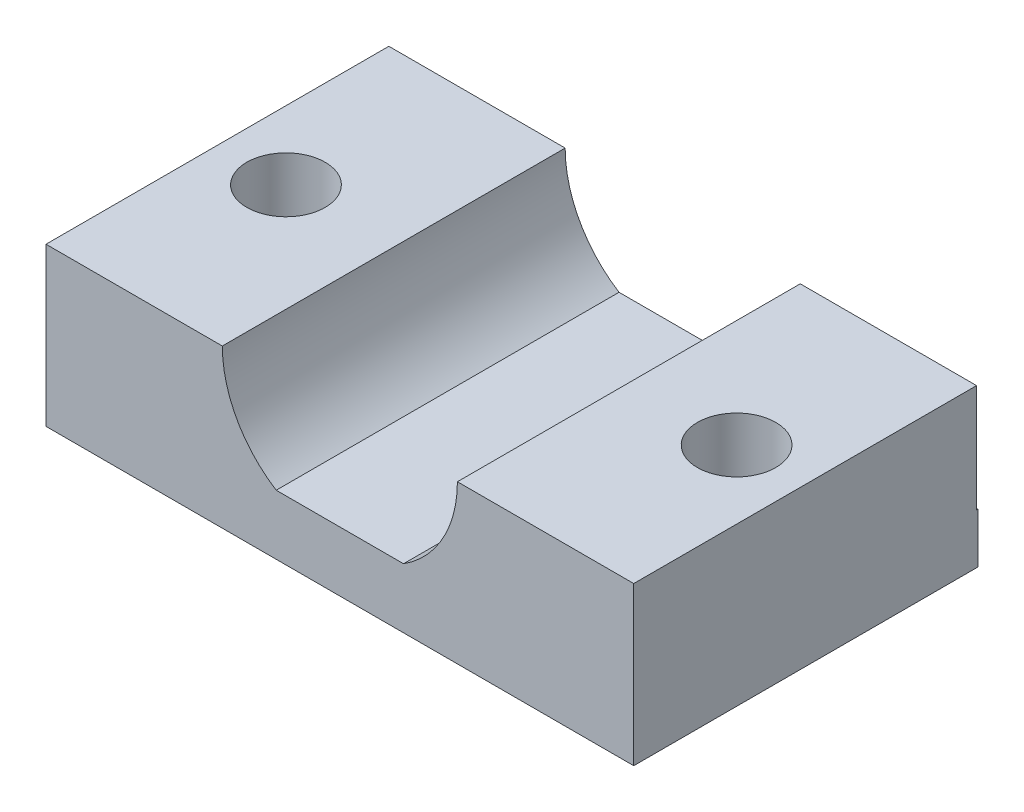
ISO-10303-21;
HEADER;
FILE_DESCRIPTION(('STEP AP214'),'2;1');
FILE_NAME('part.step','',(''),(''),'','','');
FILE_SCHEMA(('AUTOMOTIVE_DESIGN { 1 0 10303 214 1 1 1 1 }'));
ENDSEC;
DATA;
#1=APPLICATION_CONTEXT('core data for automotive mechanical design processes');
#2=APPLICATION_PROTOCOL_DEFINITION('international standard','automotive_design',2000,#1);
#3=PRODUCT_CONTEXT('',#1,'mechanical');
#4=PRODUCT('Part','Part','',(#3));
#5=PRODUCT_RELATED_PRODUCT_CATEGORY('part','',(#4));
#6=PRODUCT_DEFINITION_FORMATION('','',#4);
#7=PRODUCT_DEFINITION_CONTEXT('part definition',#1,'design');
#8=PRODUCT_DEFINITION('design','',#6,#7);
#9=PRODUCT_DEFINITION_SHAPE('','',#8);
#10=(LENGTH_UNIT() NAMED_UNIT(*) SI_UNIT(.MILLI.,.METRE.));
#11=(NAMED_UNIT(*) PLANE_ANGLE_UNIT() SI_UNIT($,.RADIAN.));
#12=(NAMED_UNIT(*) SI_UNIT($,.STERADIAN.) SOLID_ANGLE_UNIT());
#13=UNCERTAINTY_MEASURE_WITH_UNIT(LENGTH_MEASURE(1.E-05),#10,'distance_accuracy_value','');
#14=(GEOMETRIC_REPRESENTATION_CONTEXT(3) GLOBAL_UNCERTAINTY_ASSIGNED_CONTEXT((#13)) GLOBAL_UNIT_ASSIGNED_CONTEXT((#10,
#11,#12)) REPRESENTATION_CONTEXT('',''));
#15=CARTESIAN_POINT('',(0.,0.,0.));
#16=DIRECTION('',(0.,0.,1.));
#17=DIRECTION('',(1.,0.,0.));
#18=AXIS2_PLACEMENT_3D('',#15,#16,#17);
#19=CARTESIAN_POINT('',(-0.0795454545454739,36.0000025251893,-17.5));
#20=DIRECTION('',(0.,0.,1.));
#21=DIRECTION('',(1.,0.,0.));
#22=AXIS2_PLACEMENT_3D('',#19,#20,#21);
#23=PLANE('',#22);
#24=DIRECTION('',(-1.,0.,0.));
#25=VECTOR('',#24,1.);
#26=CARTESIAN_POINT('',(15.,30.5,-17.5));
#27=LINE('',#26,#25);
#28=CARTESIAN_POINT('',(15.,30.5,-17.5));
#29=VERTEX_POINT('',#28);
#30=CARTESIAN_POINT('',(-15.,30.5,-17.5));
#31=VERTEX_POINT('',#30);
#32=EDGE_CURVE('E183',#29,#31,#27,.T.);
#33=ORIENTED_EDGE('',*,*,#32,.T.);
#34=DIRECTION('',(0.,1.,0.));
#35=VECTOR('',#34,1.);
#36=CARTESIAN_POINT('',(-15.,24.,-17.5));
#37=LINE('',#36,#35);
#38=CARTESIAN_POINT('',(-15.,36.0000025251892,-17.5));
#39=VERTEX_POINT('',#38);
#40=EDGE_CURVE('E189',#31,#39,#37,.T.);
#41=ORIENTED_EDGE('',*,*,#40,.T.);
#42=DIRECTION('',(1.,0.,0.));
#43=VECTOR('',#42,1.);
#44=CARTESIAN_POINT('',(-15.,36.0000025251892,-17.5));
#45=LINE('',#44,#43);
#46=CARTESIAN_POINT('',(-6.00000000000002,36.0000025251892,-17.5));
#47=VERTEX_POINT('',#46);
#48=EDGE_CURVE('E192',#39,#47,#45,.T.);
#49=ORIENTED_EDGE('',*,*,#48,.T.);
#50=CARTESIAN_POINT('',(-0.0795454545454739,36.0000025251893,-17.5));
#51=DIRECTION('',(0.,0.,1.));
#52=DIRECTION('',(1.,0.,0.));
#53=AXIS2_PLACEMENT_3D('',#50,#51,#52);
#54=CIRCLE('',#53,5.92045454545454);
#55=CARTESIAN_POINT('',(-3.25,31.0000025251893,-17.5));
#56=VERTEX_POINT('',#55);
#57=EDGE_CURVE('E196',#47,#56,#54,.T.);
#58=ORIENTED_EDGE('',*,*,#57,.T.);
#59=DIRECTION('',(1.,0.,0.));
#60=VECTOR('',#59,1.);
#61=CARTESIAN_POINT('',(3.25,31.0000025251893,-17.5));
#62=LINE('',#61,#60);
#63=CARTESIAN_POINT('',(3.25,31.0000025251893,-17.5));
#64=VERTEX_POINT('',#63);
#65=EDGE_CURVE('E199',#56,#64,#62,.T.);
#66=ORIENTED_EDGE('',*,*,#65,.T.);
#67=CARTESIAN_POINT('',(0.0795454545454739,36.0000025251893,-17.5));
#68=DIRECTION('',(0.,0.,1.));
#69=DIRECTION('',(-1.,0.,0.));
#70=AXIS2_PLACEMENT_3D('',#67,#68,#69);
#71=CIRCLE('',#70,5.92045454545454);
#72=CARTESIAN_POINT('',(6.00000000000002,36.0000025251892,-17.5));
#73=VERTEX_POINT('',#72);
#74=EDGE_CURVE('E202',#64,#73,#71,.T.);
#75=ORIENTED_EDGE('',*,*,#74,.T.);
#76=DIRECTION('',(1.,0.,0.));
#77=VECTOR('',#76,1.);
#78=CARTESIAN_POINT('',(15.,36.0000025251892,-17.5));
#79=LINE('',#78,#77);
#80=CARTESIAN_POINT('',(15.,36.0000025251892,-17.5));
#81=VERTEX_POINT('',#80);
#82=EDGE_CURVE('E205',#73,#81,#79,.T.);
#83=ORIENTED_EDGE('',*,*,#82,.T.);
#84=DIRECTION('',(0.,-1.,0.));
#85=VECTOR('',#84,1.);
#86=CARTESIAN_POINT('',(15.,24.,-17.5));
#87=LINE('',#86,#85);
#88=EDGE_CURVE('E208',#81,#29,#87,.T.);
#89=ORIENTED_EDGE('',*,*,#88,.T.);
#90=EDGE_LOOP('',(#33,#41,#49,#58,#66,#75,#83,#89));
#91=FACE_BOUND('',#90,.T.);
#92=ADVANCED_FACE('F43',(#91),#23,.F.);
#93=CARTESIAN_POINT('',(22.5,4.,0.));
#94=DIRECTION('',(0.,0.,-1.));
#95=DIRECTION('',(-1.,0.,0.));
#96=AXIS2_PLACEMENT_3D('',#93,#94,#95);
#97=PLANE('',#96);
#98=DIRECTION('',(0.,-1.,0.));
#99=VECTOR('',#98,1.);
#100=CARTESIAN_POINT('',(-15.,24.,0.));
#101=LINE('',#100,#99);
#102=CARTESIAN_POINT('',(-15.,36.0000025251892,0.));
#103=VERTEX_POINT('',#102);
#104=CARTESIAN_POINT('',(-15.,27.9456875732357,0.));
#105=VERTEX_POINT('',#104);
#106=EDGE_CURVE('E52',#103,#105,#101,.T.);
#107=ORIENTED_EDGE('',*,*,#106,.T.);
#108=DIRECTION('',(1.,0.,0.));
#109=VECTOR('',#108,1.);
#110=CARTESIAN_POINT('',(-22.5,27.9456875732357,0.));
#111=LINE('',#110,#109);
#112=CARTESIAN_POINT('',(15.,27.9456875732357,0.));
#113=VERTEX_POINT('',#112);
#114=EDGE_CURVE('E122',#105,#113,#111,.T.);
#115=ORIENTED_EDGE('',*,*,#114,.T.);
#116=DIRECTION('',(0.,-1.,0.));
#117=VECTOR('',#116,1.);
#118=CARTESIAN_POINT('',(15.,24.,0.));
#119=LINE('',#118,#117);
#120=CARTESIAN_POINT('',(15.,36.0000025251892,0.));
#121=VERTEX_POINT('',#120);
#122=EDGE_CURVE('E148',#121,#113,#119,.T.);
#123=ORIENTED_EDGE('',*,*,#122,.F.);
#124=DIRECTION('',(1.,0.,0.));
#125=VECTOR('',#124,1.);
#126=CARTESIAN_POINT('',(15.,36.0000025251892,0.));
#127=LINE('',#126,#125);
#128=CARTESIAN_POINT('',(6.00000000000002,36.0000025251892,0.));
#129=VERTEX_POINT('',#128);
#130=EDGE_CURVE('E193',#129,#121,#127,.T.);
#131=ORIENTED_EDGE('',*,*,#130,.F.);
#132=CARTESIAN_POINT('',(0.0795454545454739,36.0000025251893,0.));
#133=DIRECTION('',(0.,0.,1.));
#134=DIRECTION('',(-1.,0.,0.));
#135=AXIS2_PLACEMENT_3D('',#132,#133,#134);
#136=CIRCLE('',#135,5.92045454545454);
#137=CARTESIAN_POINT('',(3.25,31.0000025251893,0.));
#138=VERTEX_POINT('',#137);
#139=EDGE_CURVE('E220',#138,#129,#136,.T.);
#140=ORIENTED_EDGE('',*,*,#139,.F.);
#141=DIRECTION('',(1.,0.,0.));
#142=VECTOR('',#141,1.);
#143=CARTESIAN_POINT('',(3.25,31.0000025251893,0.));
#144=LINE('',#143,#142);
#145=CARTESIAN_POINT('',(-3.25,31.0000025251893,0.));
#146=VERTEX_POINT('',#145);
#147=EDGE_CURVE('E217',#146,#138,#144,.T.);
#148=ORIENTED_EDGE('',*,*,#147,.F.);
#149=CARTESIAN_POINT('',(-0.0795454545454739,36.0000025251893,0.));
#150=DIRECTION('',(0.,0.,1.));
#151=DIRECTION('',(1.,0.,0.));
#152=AXIS2_PLACEMENT_3D('',#149,#150,#151);
#153=CIRCLE('',#152,5.92045454545454);
#154=CARTESIAN_POINT('',(-6.00000000000002,36.0000025251892,0.));
#155=VERTEX_POINT('',#154);
#156=EDGE_CURVE('E214',#155,#146,#153,.T.);
#157=ORIENTED_EDGE('',*,*,#156,.F.);
#158=DIRECTION('',(1.,0.,0.));
#159=VECTOR('',#158,1.);
#160=CARTESIAN_POINT('',(-15.,36.0000025251892,0.));
#161=LINE('',#160,#159);
#162=EDGE_CURVE('E146',#103,#155,#161,.T.);
#163=ORIENTED_EDGE('',*,*,#162,.F.);
#164=EDGE_LOOP('',(#107,#115,#123,#131,#140,#148,#157,#163));
#165=FACE_BOUND('',#164,.T.);
#166=ADVANCED_FACE('F45',(#165),#97,.F.);
#167=CARTESIAN_POINT('',(-15.,24.,-20.));
#168=DIRECTION('',(1.,0.,0.));
#169=DIRECTION('',(0.,0.,-1.));
#170=AXIS2_PLACEMENT_3D('',#167,#168,#169);
#171=PLANE('',#170);
#172=DIRECTION('',(0.,-1.,0.));
#173=VECTOR('',#172,1.);
#174=CARTESIAN_POINT('',(-15.,24.,-17.5728496854362));
#175=LINE('',#174,#173);
#176=CARTESIAN_POINT('',(-15.,30.5,-17.5728496854362));
#177=VERTEX_POINT('',#176);
#178=CARTESIAN_POINT('',(-15.,27.9456875732357,-17.5728496854362));
#179=VERTEX_POINT('',#178);
#180=EDGE_CURVE('E59',#177,#179,#175,.T.);
#181=ORIENTED_EDGE('',*,*,#180,.T.);
#182=DIRECTION('',(0.,0.,1.));
#183=VECTOR('',#182,1.);
#184=CARTESIAN_POINT('',(-15.,27.9456875732357,-20.));
#185=LINE('',#184,#183);
#186=EDGE_CURVE('E126',#179,#105,#185,.T.);
#187=ORIENTED_EDGE('',*,*,#186,.T.);
#188=ORIENTED_EDGE('',*,*,#106,.F.);
#189=DIRECTION('',(0.,0.,1.));
#190=VECTOR('',#189,1.);
#191=CARTESIAN_POINT('',(-15.,36.0000025251892,-17.5));
#192=LINE('',#191,#190);
#193=EDGE_CURVE('E151',#39,#103,#192,.T.);
#194=ORIENTED_EDGE('',*,*,#193,.F.);
#195=ORIENTED_EDGE('',*,*,#40,.F.);
#196=DIRECTION('',(0.,0.,1.));
#197=VECTOR('',#196,1.);
#198=CARTESIAN_POINT('',(-15.,30.5,-27.));
#199=LINE('',#198,#197);
#200=EDGE_CURVE('E177',#177,#31,#199,.T.);
#201=ORIENTED_EDGE('',*,*,#200,.F.);
#202=EDGE_LOOP('',(#181,#187,#188,#194,#195,#201));
#203=FACE_BOUND('',#202,.T.);
#204=ADVANCED_FACE('F137',(#203),#171,.F.);
#205=CARTESIAN_POINT('',(15.,24.,-20.));
#206=DIRECTION('',(-1.,0.,0.));
#207=DIRECTION('',(0.,0.,1.));
#208=AXIS2_PLACEMENT_3D('',#205,#206,#207);
#209=PLANE('',#208);
#210=ORIENTED_EDGE('',*,*,#122,.T.);
#211=DIRECTION('',(0.,0.,-1.));
#212=VECTOR('',#211,1.);
#213=CARTESIAN_POINT('',(15.,27.9456875732357,-20.));
#214=LINE('',#213,#212);
#215=CARTESIAN_POINT('',(15.,27.9456875732357,-17.5728496854362));
#216=VERTEX_POINT('',#215);
#217=EDGE_CURVE('E128',#113,#216,#214,.T.);
#218=ORIENTED_EDGE('',*,*,#217,.T.);
#219=DIRECTION('',(0.,1.,0.));
#220=VECTOR('',#219,1.);
#221=CARTESIAN_POINT('',(15.,24.,-17.5728496854362));
#222=LINE('',#221,#220);
#223=CARTESIAN_POINT('',(15.,30.5,-17.5728496854362));
#224=VERTEX_POINT('',#223);
#225=EDGE_CURVE('E142',#216,#224,#222,.T.);
#226=ORIENTED_EDGE('',*,*,#225,.T.);
#227=DIRECTION('',(0.,0.,1.));
#228=VECTOR('',#227,1.);
#229=CARTESIAN_POINT('',(15.,30.5,-27.));
#230=LINE('',#229,#228);
#231=EDGE_CURVE('E66',#224,#29,#230,.T.);
#232=ORIENTED_EDGE('',*,*,#231,.T.);
#233=ORIENTED_EDGE('',*,*,#88,.F.);
#234=DIRECTION('',(0.,0.,1.));
#235=VECTOR('',#234,1.);
#236=CARTESIAN_POINT('',(15.,36.0000025251892,-17.5));
#237=LINE('',#236,#235);
#238=EDGE_CURVE('E211',#81,#121,#237,.T.);
#239=ORIENTED_EDGE('',*,*,#238,.T.);
#240=EDGE_LOOP('',(#210,#218,#226,#232,#233,#239));
#241=FACE_BOUND('',#240,.T.);
#242=ADVANCED_FACE('F255',(#241),#209,.F.);
#243=CARTESIAN_POINT('',(-15.,36.0000025251892,-17.5));
#244=DIRECTION('',(0.,-1.,0.));
#245=DIRECTION('',(1.,0.,0.));
#246=AXIS2_PLACEMENT_3D('',#243,#244,#245);
#247=PLANE('',#246);
#248=CARTESIAN_POINT('',(-11.4999999999999,36.0000025251892,-8.75));
#249=DIRECTION('',(0.,1.,0.));
#250=DIRECTION('',(-1.,0.,0.));
#251=AXIS2_PLACEMENT_3D('',#248,#249,#250);
#252=CIRCLE('',#251,2.);
#253=CARTESIAN_POINT('',(-13.4999999999999,36.0000025251892,-8.75));
#254=VERTEX_POINT('',#253);
#255=EDGE_CURVE('E173',#254,#254,#252,.T.);
#256=ORIENTED_EDGE('',*,*,#255,.F.);
#257=EDGE_LOOP('',(#256));
#258=FACE_BOUND('',#257,.T.);
#259=ORIENTED_EDGE('',*,*,#162,.T.);
#260=DIRECTION('',(0.,0.,1.));
#261=VECTOR('',#260,1.);
#262=CARTESIAN_POINT('',(-6.00000000000002,36.0000025251892,-17.5));
#263=LINE('',#262,#261);
#264=EDGE_CURVE('E241',#47,#155,#263,.T.);
#265=ORIENTED_EDGE('',*,*,#264,.F.);
#266=ORIENTED_EDGE('',*,*,#48,.F.);
#267=ORIENTED_EDGE('',*,*,#193,.T.);
#268=EDGE_LOOP('',(#259,#265,#266,#267));
#269=FACE_BOUND('',#268,.T.);
#270=ADVANCED_FACE('F247',(#258,#269),#247,.F.);
#271=CARTESIAN_POINT('',(-0.0795454545454739,36.0000025251893,-17.5));
#272=DIRECTION('',(0.,0.,1.));
#273=DIRECTION('',(1.,0.,0.));
#274=AXIS2_PLACEMENT_3D('',#271,#272,#273);
#275=CYLINDRICAL_SURFACE('',#274,5.92045454545454);
#276=ORIENTED_EDGE('',*,*,#156,.T.);
#277=DIRECTION('',(0.,0.,1.));
#278=VECTOR('',#277,1.);
#279=CARTESIAN_POINT('',(-3.25,31.0000025251893,-17.5));
#280=LINE('',#279,#278);
#281=EDGE_CURVE('E237',#56,#146,#280,.T.);
#282=ORIENTED_EDGE('',*,*,#281,.F.);
#283=ORIENTED_EDGE('',*,*,#57,.F.);
#284=ORIENTED_EDGE('',*,*,#264,.T.);
#285=EDGE_LOOP('',(#276,#282,#283,#284));
#286=FACE_BOUND('',#285,.T.);
#287=ADVANCED_FACE('F274',(#286),#275,.F.);
#288=CARTESIAN_POINT('',(3.25,31.0000025251893,-17.5));
#289=DIRECTION('',(0.,-1.,0.));
#290=DIRECTION('',(0.,0.,-1.));
#291=AXIS2_PLACEMENT_3D('',#288,#289,#290);
#292=PLANE('',#291);
#293=ORIENTED_EDGE('',*,*,#147,.T.);
#294=DIRECTION('',(0.,0.,1.));
#295=VECTOR('',#294,1.);
#296=CARTESIAN_POINT('',(3.25,31.0000025251893,-17.5));
#297=LINE('',#296,#295);
#298=EDGE_CURVE('E233',#64,#138,#297,.T.);
#299=ORIENTED_EDGE('',*,*,#298,.F.);
#300=ORIENTED_EDGE('',*,*,#65,.F.);
#301=ORIENTED_EDGE('',*,*,#281,.T.);
#302=EDGE_LOOP('',(#293,#299,#300,#301));
#303=FACE_BOUND('',#302,.T.);
#304=ADVANCED_FACE('F269',(#303),#292,.F.);
#305=CARTESIAN_POINT('',(0.0795454545454739,36.0000025251893,-17.5));
#306=DIRECTION('',(0.,0.,1.));
#307=DIRECTION('',(1.,0.,0.));
#308=AXIS2_PLACEMENT_3D('',#305,#306,#307);
#309=CYLINDRICAL_SURFACE('',#308,5.92045454545454);
#310=ORIENTED_EDGE('',*,*,#139,.T.);
#311=DIRECTION('',(0.,0.,1.));
#312=VECTOR('',#311,1.);
#313=CARTESIAN_POINT('',(6.00000000000002,36.0000025251892,-17.5));
#314=LINE('',#313,#312);
#315=EDGE_CURVE('E229',#73,#129,#314,.T.);
#316=ORIENTED_EDGE('',*,*,#315,.F.);
#317=ORIENTED_EDGE('',*,*,#74,.F.);
#318=ORIENTED_EDGE('',*,*,#298,.T.);
#319=EDGE_LOOP('',(#310,#316,#317,#318));
#320=FACE_BOUND('',#319,.T.);
#321=ADVANCED_FACE('F265',(#320),#309,.F.);
#322=CARTESIAN_POINT('',(15.,36.0000025251892,-17.5));
#323=DIRECTION('',(0.,-1.,0.));
#324=DIRECTION('',(1.,0.,0.));
#325=AXIS2_PLACEMENT_3D('',#322,#323,#324);
#326=PLANE('',#325);
#327=CARTESIAN_POINT('',(11.5000000000001,36.0000025251892,-8.75));
#328=DIRECTION('',(0.,1.,0.));
#329=DIRECTION('',(-1.,0.,0.));
#330=AXIS2_PLACEMENT_3D('',#327,#328,#329);
#331=CIRCLE('',#330,2.);
#332=CARTESIAN_POINT('',(9.50000000000005,36.0000025251892,-8.75));
#333=VERTEX_POINT('',#332);
#334=EDGE_CURVE('E172',#333,#333,#331,.T.);
#335=ORIENTED_EDGE('',*,*,#334,.F.);
#336=EDGE_LOOP('',(#335));
#337=FACE_BOUND('',#336,.T.);
#338=ORIENTED_EDGE('',*,*,#130,.T.);
#339=ORIENTED_EDGE('',*,*,#238,.F.);
#340=ORIENTED_EDGE('',*,*,#82,.F.);
#341=ORIENTED_EDGE('',*,*,#315,.T.);
#342=EDGE_LOOP('',(#338,#339,#340,#341));
#343=FACE_BOUND('',#342,.T.);
#344=ADVANCED_FACE('F260',(#337,#343),#326,.F.);
#345=CARTESIAN_POINT('',(15.,30.5,-27.));
#346=DIRECTION('',(0.,-1.,0.));
#347=DIRECTION('',(0.,0.,-1.));
#348=AXIS2_PLACEMENT_3D('',#345,#346,#347);
#349=PLANE('',#348);
#350=ORIENTED_EDGE('',*,*,#231,.F.);
#351=DIRECTION('',(-1.,0.,0.));
#352=VECTOR('',#351,1.);
#353=CARTESIAN_POINT('',(15.,30.5,-17.5728496854362));
#354=LINE('',#353,#352);
#355=EDGE_CURVE('E11',#224,#177,#354,.T.);
#356=ORIENTED_EDGE('',*,*,#355,.T.);
#357=ORIENTED_EDGE('',*,*,#200,.T.);
#358=ORIENTED_EDGE('',*,*,#32,.F.);
#359=EDGE_LOOP('',(#350,#356,#357,#358));
#360=FACE_BOUND('',#359,.T.);
#361=ADVANCED_FACE('F253',(#360),#349,.F.);
#362=CARTESIAN_POINT('',(11.5000000000001,26.0000025251892,-8.75));
#363=DIRECTION('',(0.,1.,0.));
#364=DIRECTION('',(-1.,0.,0.));
#365=AXIS2_PLACEMENT_3D('',#362,#363,#364);
#366=CYLINDRICAL_SURFACE('',#365,2.);
#367=CARTESIAN_POINT('',(11.5000000000001,27.9456875732357,-8.75));
#368=DIRECTION('',(0.,1.,0.));
#369=DIRECTION('',(0.,0.,1.));
#370=AXIS2_PLACEMENT_3D('',#367,#368,#369);
#371=CIRCLE('',#370,2.);
#372=CARTESIAN_POINT('',(11.5000000000001,27.9456875732357,-6.75));
#373=VERTEX_POINT('',#372);
#374=EDGE_CURVE('E156',#373,#373,#371,.F.);
#375=ORIENTED_EDGE('',*,*,#374,.T.);
#376=EDGE_LOOP('',(#375));
#377=FACE_BOUND('',#376,.T.);
#378=ORIENTED_EDGE('',*,*,#334,.T.);
#379=EDGE_LOOP('',(#378));
#380=FACE_BOUND('',#379,.T.);
#381=ADVANCED_FACE('F312',(#377,#380),#366,.F.);
#382=CARTESIAN_POINT('',(-11.4999999999999,26.0000025251892,-8.75));
#383=DIRECTION('',(0.,1.,0.));
#384=DIRECTION('',(-1.,0.,0.));
#385=AXIS2_PLACEMENT_3D('',#382,#383,#384);
#386=CYLINDRICAL_SURFACE('',#385,2.);
#387=CARTESIAN_POINT('',(-11.4999999999999,27.9456875732357,-8.75));
#388=DIRECTION('',(0.,1.,0.));
#389=DIRECTION('',(0.,0.,1.));
#390=AXIS2_PLACEMENT_3D('',#387,#388,#389);
#391=CIRCLE('',#390,2.);
#392=CARTESIAN_POINT('',(-11.4999999999999,27.9456875732357,-6.75));
#393=VERTEX_POINT('',#392);
#394=EDGE_CURVE('E133',#393,#393,#391,.F.);
#395=ORIENTED_EDGE('',*,*,#394,.T.);
#396=EDGE_LOOP('',(#395));
#397=FACE_BOUND('',#396,.T.);
#398=ORIENTED_EDGE('',*,*,#255,.T.);
#399=EDGE_LOOP('',(#398));
#400=FACE_BOUND('',#399,.T.);
#401=ADVANCED_FACE('F319',(#397,#400),#386,.F.);
#402=CARTESIAN_POINT('',(-22.5,27.9456875732357,-17.5728496854362));
#403=DIRECTION('',(0.,0.,1.));
#404=DIRECTION('',(1.,0.,0.));
#405=AXIS2_PLACEMENT_3D('',#402,#403,#404);
#406=PLANE('',#405);
#407=ORIENTED_EDGE('',*,*,#355,.F.);
#408=ORIENTED_EDGE('',*,*,#225,.F.);
#409=DIRECTION('',(1.,0.,0.));
#410=VECTOR('',#409,1.);
#411=CARTESIAN_POINT('',(-22.5,27.9456875732357,-17.5728496854362));
#412=LINE('',#411,#410);
#413=EDGE_CURVE('E134',#179,#216,#412,.T.);
#414=ORIENTED_EDGE('',*,*,#413,.F.);
#415=ORIENTED_EDGE('',*,*,#180,.F.);
#416=EDGE_LOOP('',(#407,#408,#414,#415));
#417=FACE_BOUND('',#416,.T.);
#418=ADVANCED_FACE('F254',(#417),#406,.F.);
#419=CARTESIAN_POINT('',(-22.5,27.9456875732357,0.));
#420=DIRECTION('',(0.,1.,0.));
#421=DIRECTION('',(0.,0.,1.));
#422=AXIS2_PLACEMENT_3D('',#419,#420,#421);
#423=PLANE('',#422);
#424=ORIENTED_EDGE('',*,*,#394,.F.);
#425=EDGE_LOOP('',(#424));
#426=FACE_BOUND('',#425,.T.);
#427=ORIENTED_EDGE('',*,*,#374,.F.);
#428=EDGE_LOOP('',(#427));
#429=FACE_BOUND('',#428,.T.);
#430=ORIENTED_EDGE('',*,*,#413,.T.);
#431=ORIENTED_EDGE('',*,*,#217,.F.);
#432=ORIENTED_EDGE('',*,*,#114,.F.);
#433=ORIENTED_EDGE('',*,*,#186,.F.);
#434=EDGE_LOOP('',(#430,#431,#432,#433));
#435=FACE_BOUND('',#434,.T.);
#436=ADVANCED_FACE('F125',(#426,#429,#435),#423,.F.);
#437=CLOSED_SHELL('',(#92,#166,#204,#242,#270,#287,#304,#321,#344,#361,#381,#401,#418,#436));
#438=MANIFOLD_SOLID_BREP('B2',#437);
#439=ADVANCED_BREP_SHAPE_REPRESENTATION('',(#18,#438),#14);
#440=SHAPE_DEFINITION_REPRESENTATION(#9,#439);
ENDSEC;
END-ISO-10303-21;
